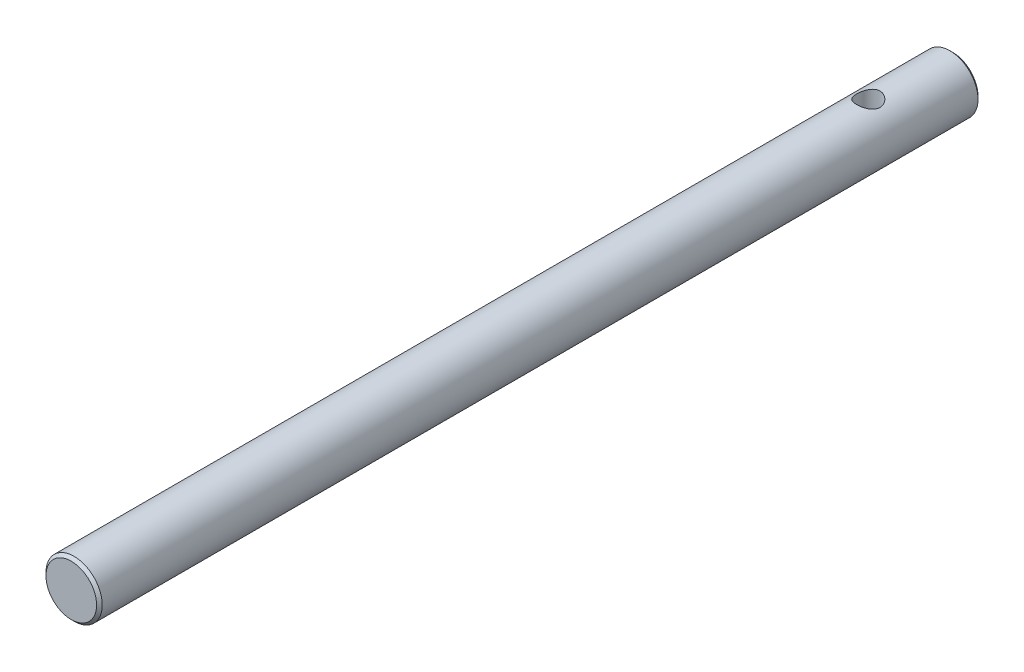
ISO-10303-21;
HEADER;
FILE_DESCRIPTION(('STEP AP214'),'2;1');
FILE_NAME('part.step','',(''),(''),'','','');
FILE_SCHEMA(('AUTOMOTIVE_DESIGN { 1 0 10303 214 1 1 1 1 }'));
ENDSEC;
DATA;
#1=APPLICATION_CONTEXT('core data for automotive mechanical design processes');
#2=APPLICATION_PROTOCOL_DEFINITION('international standard','automotive_design',2000,#1);
#3=PRODUCT_CONTEXT('',#1,'mechanical');
#4=PRODUCT('Part','Part','',(#3));
#5=PRODUCT_RELATED_PRODUCT_CATEGORY('part','',(#4));
#6=PRODUCT_DEFINITION_FORMATION('','',#4);
#7=PRODUCT_DEFINITION_CONTEXT('part definition',#1,'design');
#8=PRODUCT_DEFINITION('design','',#6,#7);
#9=PRODUCT_DEFINITION_SHAPE('','',#8);
#10=(LENGTH_UNIT() NAMED_UNIT(*) SI_UNIT(.MILLI.,.METRE.));
#11=(NAMED_UNIT(*) PLANE_ANGLE_UNIT() SI_UNIT($,.RADIAN.));
#12=(NAMED_UNIT(*) SI_UNIT($,.STERADIAN.) SOLID_ANGLE_UNIT());
#13=UNCERTAINTY_MEASURE_WITH_UNIT(LENGTH_MEASURE(1.E-05),#10,'distance_accuracy_value','');
#14=(GEOMETRIC_REPRESENTATION_CONTEXT(3) GLOBAL_UNCERTAINTY_ASSIGNED_CONTEXT((#13)) GLOBAL_UNIT_ASSIGNED_CONTEXT((#10,
#11,#12)) REPRESENTATION_CONTEXT('',''));
#15=CARTESIAN_POINT('',(0.,0.,0.));
#16=DIRECTION('',(0.,0.,1.));
#17=DIRECTION('',(1.,0.,0.));
#18=AXIS2_PLACEMENT_3D('',#15,#16,#17);
#19=CARTESIAN_POINT('',(0.,0.,94.));
#20=DIRECTION('',(0.,0.,-1.));
#21=DIRECTION('',(-1.,0.,0.));
#22=AXIS2_PLACEMENT_3D('',#19,#20,#21);
#23=CYLINDRICAL_SURFACE('',#22,3.);
#24=CARTESIAN_POINT('',(0.,0.,93.7));
#25=DIRECTION('',(0.,0.,1.));
#26=DIRECTION('',(1.,0.,0.));
#27=AXIS2_PLACEMENT_3D('',#24,#25,#26);
#28=CIRCLE('',#27,3.);
#29=CARTESIAN_POINT('',(3.,0.,93.7));
#30=VERTEX_POINT('',#29);
#31=EDGE_CURVE('E38',#30,#30,#28,.F.);
#32=ORIENTED_EDGE('',*,*,#31,.T.);
#33=EDGE_LOOP('',(#32));
#34=FACE_BOUND('',#33,.T.);
#35=CARTESIAN_POINT('',(0.,0.,0.300000000000036));
#36=DIRECTION('',(0.,0.,1.));
#37=DIRECTION('',(1.,0.,0.));
#38=AXIS2_PLACEMENT_3D('',#35,#36,#37);
#39=CIRCLE('',#38,3.);
#40=CARTESIAN_POINT('',(3.,0.,0.300000000000036));
#41=VERTEX_POINT('',#40);
#42=EDGE_CURVE('E42',#41,#41,#39,.T.);
#43=ORIENTED_EDGE('',*,*,#42,.T.);
#44=EDGE_LOOP('',(#43));
#45=FACE_BOUND('',#44,.T.);
#46=CARTESIAN_POINT('',(0.,-3.,10.25));
#47=CARTESIAN_POINT('',(0.0669580526362668,-2.99999458367273,10.2499927949087));
#48=CARTESIAN_POINT('',(0.134021397063841,-2.9977323297471,10.2445880414719));
#49=CARTESIAN_POINT('',(0.266247371156347,-2.98890153579552,10.2231609350798));
#50=CARTESIAN_POINT('',(0.331404576423564,-2.98232175901028,10.2071108755357));
#51=CARTESIAN_POINT('',(0.457688733653088,-2.96556289038127,10.1650889082194));
#52=CARTESIAN_POINT('',(0.518828524426269,-2.95539599975004,10.1391506105318));
#53=CARTESIAN_POINT('',(0.635829756679803,-2.93245286470664,10.0782271767674));
#54=CARTESIAN_POINT('',(0.69169279001594,-2.91967741092849,10.0432447810291));
#55=CARTESIAN_POINT('',(0.799448403559513,-2.89207828351869,9.96337101740911));
#56=CARTESIAN_POINT('',(0.85104126751777,-2.87718753326093,9.91809869121024));
#57=CARTESIAN_POINT('',(0.946159821091264,-2.84732714068513,9.81973566521743));
#58=CARTESIAN_POINT('',(0.989681263153087,-2.83235746106809,9.76664087510549));
#59=CARTESIAN_POINT('',(1.06953737697066,-2.80321021812995,9.6509732224351));
#60=CARTESIAN_POINT('',(1.10541308153925,-2.78910786873385,9.58806255157345));
#61=CARTESIAN_POINT('',(1.16593940588866,-2.76435572357005,9.45642674207907));
#62=CARTESIAN_POINT('',(1.19059580836291,-2.75370415000823,9.38770462051554));
#63=CARTESIAN_POINT('',(1.22674598312159,-2.73778555387705,9.24984630823207));
#64=CARTESIAN_POINT('',(1.23881657877606,-2.73228387651787,9.18088951660784));
#65=CARTESIAN_POINT('',(1.25125209967797,-2.72661326219504,9.04172670731342));
#66=CARTESIAN_POINT('',(1.25162348054397,-2.7264413842526,8.97152139997425));
#67=CARTESIAN_POINT('',(1.24108450363674,-2.73125119560852,8.83759993956506));
#68=CARTESIAN_POINT('',(1.23103681112301,-2.73583882723623,8.77379890343553));
#69=CARTESIAN_POINT('',(1.20139191015777,-2.74898482773796,8.6488879089996));
#70=CARTESIAN_POINT('',(1.18179287287177,-2.75754395703563,8.58777846850822));
#71=CARTESIAN_POINT('',(1.13321958727571,-2.77786184772756,8.46844229700855));
#72=CARTESIAN_POINT('',(1.10405471539236,-2.78968481949136,8.41030457908661));
#73=CARTESIAN_POINT('',(1.03731242580562,-2.81518331141086,8.29952226611985));
#74=CARTESIAN_POINT('',(0.999731690519546,-2.82885956129779,8.24687984938648));
#75=CARTESIAN_POINT('',(0.913495965543837,-2.85792976877979,8.14390004126716));
#76=CARTESIAN_POINT('',(0.864173483207529,-2.87337121404473,8.09413343261456));
#77=CARTESIAN_POINT('',(0.757729591051514,-2.90325673112529,8.00338649704081));
#78=CARTESIAN_POINT('',(0.700606359448459,-2.9177005687701,7.96240822830781));
#79=CARTESIAN_POINT('',(0.578447948693378,-2.94438283556473,7.88956417638373));
#80=CARTESIAN_POINT('',(0.513260582447682,-2.95656266543333,7.85793055484931));
#81=CARTESIAN_POINT('',(0.377852402526833,-2.97689481414803,7.80627886039673));
#82=CARTESIAN_POINT('',(0.307634394795036,-2.985049358458,7.78625436805618));
#83=CARTESIAN_POINT('',(0.16892811334623,-2.99599641186385,7.75958400787335));
#84=CARTESIAN_POINT('',(0.100611285278641,-2.99909541047125,7.75217214255624));
#85=CARTESIAN_POINT('',(-0.0363546554960879,-3.00056050368745,7.7486537763859));
#86=CARTESIAN_POINT('',(-0.105003667152635,-2.99892795711939,7.75254402974799));
#87=CARTESIAN_POINT('',(-0.237098242341435,-2.9913121765694,7.77097108480606));
#88=CARTESIAN_POINT('',(-0.300632966639386,-2.98554887283989,7.78496995409719));
#89=CARTESIAN_POINT('',(-0.424382748971091,-2.97048606772414,7.82246819454078));
#90=CARTESIAN_POINT('',(-0.484597386518361,-2.96118611959704,7.84596876595029));
#91=CARTESIAN_POINT('',(-0.602108999869137,-2.93958270645166,7.90257097571211));
#92=CARTESIAN_POINT('',(-0.659257236855325,-2.92719491469281,7.93594818314603));
#93=CARTESIAN_POINT('',(-0.76734621623143,-2.9007380457909,8.01105337779169));
#94=CARTESIAN_POINT('',(-0.818284352601942,-2.88666826768733,8.05278485152927));
#95=CARTESIAN_POINT('',(-0.916333430274264,-2.85712087895437,8.1469032332724));
#96=CARTESIAN_POINT('',(-0.962910697979836,-2.84161451591029,8.19983850298625));
#97=CARTESIAN_POINT('',(-1.04666984610551,-2.81184336768005,8.31302127593538));
#98=CARTESIAN_POINT('',(-1.08384959285618,-2.79757886493438,8.37327043517173));
#99=CARTESIAN_POINT('',(-1.14815960208699,-2.77181386243988,8.50061417530257));
#100=CARTESIAN_POINT('',(-1.17513918237329,-2.76035562555111,8.56779403551482));
#101=CARTESIAN_POINT('',(-1.21717413951573,-2.74208355658957,8.7063705938101));
#102=CARTESIAN_POINT('',(-1.23223934863688,-2.73526589555752,8.77776376248334));
#103=CARTESIAN_POINT('',(-1.24904080348901,-2.72763164537264,8.9168186991992));
#104=CARTESIAN_POINT('',(-1.25171380413129,-2.72639350967162,8.98434466229261));
#105=CARTESIAN_POINT('',(-1.24615575523912,-2.72893853011024,9.1188428611411));
#106=CARTESIAN_POINT('',(-1.23792637964722,-2.73272091540306,9.18581518031369));
#107=CARTESIAN_POINT('',(-1.21158404780491,-2.74449551302268,9.31409274746888));
#108=CARTESIAN_POINT('',(-1.19394903571466,-2.7522835484648,9.37551667346338));
#109=CARTESIAN_POINT('',(-1.14976328202135,-2.77103181199189,9.49454802135722));
#110=CARTESIAN_POINT('',(-1.12321003517252,-2.78199293131693,9.55215436539878));
#111=CARTESIAN_POINT('',(-1.0601028593549,-2.80666954560013,9.66569589594912));
#112=CARTESIAN_POINT('',(-1.02304360910483,-2.82051102713679,9.72132233016828));
#113=CARTESIAN_POINT('',(-0.940684072630393,-2.84903689053839,9.82586013936068));
#114=CARTESIAN_POINT('',(-0.89538092890562,-2.86372156345875,9.87476917560057));
#115=CARTESIAN_POINT('',(-0.793902045778821,-2.89356392850106,9.96814868168474));
#116=CARTESIAN_POINT('',(-0.737174739949028,-2.90867817511791,10.0120364328406));
#117=CARTESIAN_POINT('',(-0.6166000792532,-2.9366014362202,10.0896994535436));
#118=CARTESIAN_POINT('',(-0.552749497945747,-2.9494093991674,10.1234701148895));
#119=CARTESIAN_POINT('',(-0.420732056717951,-2.97109183362461,10.1792098454399));
#120=CARTESIAN_POINT('',(-0.352653990980636,-2.98002782581964,10.2013647666173));
#121=CARTESIAN_POINT('',(-0.213410421846559,-2.99321009768625,10.2337063290778));
#122=CARTESIAN_POINT('',(-0.142255316980959,-2.99747105811967,10.2439304425299));
#123=CARTESIAN_POINT('',(-0.0472360819191842,-2.99972287568934,10.2493331610864));
#124=CARTESIAN_POINT('',(-0.0236245946756576,-3.00000191102536,10.2500025421492));
#125=CARTESIAN_POINT('',(0.,-3.,10.25));
#126=B_SPLINE_CURVE_WITH_KNOTS('',3,(#46,#47,#48,#49,#50,#51,#52,#53,#54,#55,#56,#57,#58,#59,
#60,#61,#62,#63,#64,#65,#66,#67,#68,#69,#70,#71,#72,#73,#74,#75,#76,#77,#78,#79,#80,#81,#82,#83,
#84,#85,#86,#87,#88,#89,#90,#91,#92,#93,#94,#95,#96,#97,#98,#99,#100,#101,#102,#103,#104,#105,
#106,#107,#108,#109,#110,#111,#112,#113,#114,#115,#116,#117,#118,#119,#120,#121,#122,#123,#124,
#125),.UNSPECIFIED.,.T.,.F.,(4,2,2,2,2,2,2,2,2,2,2,2,2,2,2,2,2,2,2,2,2,2,2,2,2,2,2,2,2,2,2,2,2,
2,2,2,2,2,2,4),(0.,0.200806918883939,0.402138540628697,0.602791851906302,0.803384436852975,
1.01317936288807,1.22308438131466,1.44331724539125,1.66343646730588,1.87295273137558,
2.08235338249046,2.27570157202557,2.46908679727213,2.66658713058715,2.86416545717207,
3.07844141127897,3.29276749314588,3.51204055060814,3.73119224218297,3.93648443393251,
4.14171767493172,4.33676589735722,4.53183876601786,4.73297135272162,4.93418805469496,
5.14978488029295,5.36543061240342,5.58414788359524,5.80268447074581,6.00439877559645,
6.20608211297537,6.39837649964763,6.59072494950613,6.79463893397442,6.99862373425945,
7.2174653500489,7.43640649428584,7.65172855819386,7.86637250469322,7.93722256499099),.UNSPECIFIED.);
#127=CARTESIAN_POINT('',(0.,-3.,10.25));
#128=VERTEX_POINT('',#127);
#129=EDGE_CURVE('E51',#128,#128,#126,.T.);
#130=ORIENTED_EDGE('',*,*,#129,.T.);
#131=EDGE_LOOP('',(#130));
#132=FACE_BOUND('',#131,.T.);
#133=CARTESIAN_POINT('',(0.,3.,10.25));
#134=CARTESIAN_POINT('',(-0.0669580526362668,2.99999458367273,10.2499927949087));
#135=CARTESIAN_POINT('',(-0.134021397063841,2.9977323297471,10.2445880414719));
#136=CARTESIAN_POINT('',(-0.266247371156347,2.98890153579552,10.2231609350798));
#137=CARTESIAN_POINT('',(-0.331404576423564,2.98232175901028,10.2071108755357));
#138=CARTESIAN_POINT('',(-0.457688733653088,2.96556289038127,10.1650889082194));
#139=CARTESIAN_POINT('',(-0.518828524426269,2.95539599975004,10.1391506105318));
#140=CARTESIAN_POINT('',(-0.635829756679803,2.93245286470664,10.0782271767674));
#141=CARTESIAN_POINT('',(-0.69169279001594,2.91967741092849,10.0432447810291));
#142=CARTESIAN_POINT('',(-0.799448403559513,2.89207828351869,9.96337101740911));
#143=CARTESIAN_POINT('',(-0.85104126751777,2.87718753326093,9.91809869121024));
#144=CARTESIAN_POINT('',(-0.946159821091264,2.84732714068513,9.81973566521743));
#145=CARTESIAN_POINT('',(-0.989681263153087,2.83235746106809,9.76664087510549));
#146=CARTESIAN_POINT('',(-1.06953737697066,2.80321021812995,9.6509732224351));
#147=CARTESIAN_POINT('',(-1.10541308153925,2.78910786873385,9.58806255157345));
#148=CARTESIAN_POINT('',(-1.16593940588866,2.76435572357005,9.45642674207907));
#149=CARTESIAN_POINT('',(-1.19059580836291,2.75370415000823,9.38770462051554));
#150=CARTESIAN_POINT('',(-1.22674598312159,2.73778555387705,9.24984630823207));
#151=CARTESIAN_POINT('',(-1.23881657877606,2.73228387651787,9.18088951660784));
#152=CARTESIAN_POINT('',(-1.25125209967797,2.72661326219504,9.04172670731342));
#153=CARTESIAN_POINT('',(-1.25162348054397,2.7264413842526,8.97152139997425));
#154=CARTESIAN_POINT('',(-1.24108450363674,2.73125119560852,8.83759993956506));
#155=CARTESIAN_POINT('',(-1.23103681112301,2.73583882723623,8.77379890343553));
#156=CARTESIAN_POINT('',(-1.20139191015777,2.74898482773796,8.6488879089996));
#157=CARTESIAN_POINT('',(-1.18179287287177,2.75754395703563,8.58777846850822));
#158=CARTESIAN_POINT('',(-1.13321958727571,2.77786184772756,8.46844229700855));
#159=CARTESIAN_POINT('',(-1.10405471539236,2.78968481949136,8.41030457908661));
#160=CARTESIAN_POINT('',(-1.03731242580562,2.81518331141086,8.29952226611985));
#161=CARTESIAN_POINT('',(-0.999731690519546,2.82885956129779,8.24687984938648));
#162=CARTESIAN_POINT('',(-0.913495965543837,2.85792976877979,8.14390004126716));
#163=CARTESIAN_POINT('',(-0.864173483207529,2.87337121404473,8.09413343261456));
#164=CARTESIAN_POINT('',(-0.757729591051514,2.90325673112529,8.00338649704081));
#165=CARTESIAN_POINT('',(-0.700606359448459,2.9177005687701,7.96240822830781));
#166=CARTESIAN_POINT('',(-0.578447948693378,2.94438283556473,7.88956417638373));
#167=CARTESIAN_POINT('',(-0.513260582447682,2.95656266543333,7.85793055484931));
#168=CARTESIAN_POINT('',(-0.377852402526833,2.97689481414803,7.80627886039673));
#169=CARTESIAN_POINT('',(-0.307634394795036,2.985049358458,7.78625436805618));
#170=CARTESIAN_POINT('',(-0.16892811334623,2.99599641186385,7.75958400787335));
#171=CARTESIAN_POINT('',(-0.100611285278641,2.99909541047125,7.75217214255624));
#172=CARTESIAN_POINT('',(0.0363546554960879,3.00056050368745,7.7486537763859));
#173=CARTESIAN_POINT('',(0.105003667152635,2.99892795711939,7.75254402974799));
#174=CARTESIAN_POINT('',(0.237098242341435,2.9913121765694,7.77097108480606));
#175=CARTESIAN_POINT('',(0.300632966639386,2.98554887283989,7.78496995409719));
#176=CARTESIAN_POINT('',(0.424382748971091,2.97048606772414,7.82246819454078));
#177=CARTESIAN_POINT('',(0.484597386518361,2.96118611959704,7.84596876595029));
#178=CARTESIAN_POINT('',(0.602108999869137,2.93958270645166,7.90257097571211));
#179=CARTESIAN_POINT('',(0.659257236855325,2.92719491469281,7.93594818314603));
#180=CARTESIAN_POINT('',(0.76734621623143,2.9007380457909,8.01105337779169));
#181=CARTESIAN_POINT('',(0.818284352601942,2.88666826768733,8.05278485152927));
#182=CARTESIAN_POINT('',(0.916333430274264,2.85712087895437,8.1469032332724));
#183=CARTESIAN_POINT('',(0.962910697979836,2.84161451591029,8.19983850298625));
#184=CARTESIAN_POINT('',(1.04666984610551,2.81184336768005,8.31302127593538));
#185=CARTESIAN_POINT('',(1.08384959285618,2.79757886493438,8.37327043517173));
#186=CARTESIAN_POINT('',(1.14815960208699,2.77181386243988,8.50061417530257));
#187=CARTESIAN_POINT('',(1.17513918237329,2.76035562555111,8.56779403551482));
#188=CARTESIAN_POINT('',(1.21717413951573,2.74208355658957,8.7063705938101));
#189=CARTESIAN_POINT('',(1.23223934863688,2.73526589555752,8.77776376248334));
#190=CARTESIAN_POINT('',(1.24904080348901,2.72763164537264,8.9168186991992));
#191=CARTESIAN_POINT('',(1.25171380413129,2.72639350967162,8.98434466229261));
#192=CARTESIAN_POINT('',(1.24615575523912,2.72893853011024,9.1188428611411));
#193=CARTESIAN_POINT('',(1.23792637964722,2.73272091540306,9.18581518031369));
#194=CARTESIAN_POINT('',(1.21158404780491,2.74449551302268,9.31409274746888));
#195=CARTESIAN_POINT('',(1.19394903571466,2.7522835484648,9.37551667346338));
#196=CARTESIAN_POINT('',(1.14976328202135,2.77103181199189,9.49454802135722));
#197=CARTESIAN_POINT('',(1.12321003517252,2.78199293131693,9.55215436539878));
#198=CARTESIAN_POINT('',(1.0601028593549,2.80666954560013,9.66569589594912));
#199=CARTESIAN_POINT('',(1.02304360910483,2.82051102713679,9.72132233016828));
#200=CARTESIAN_POINT('',(0.940684072630393,2.84903689053839,9.82586013936068));
#201=CARTESIAN_POINT('',(0.89538092890562,2.86372156345875,9.87476917560057));
#202=CARTESIAN_POINT('',(0.793902045778821,2.89356392850106,9.96814868168474));
#203=CARTESIAN_POINT('',(0.737174739949028,2.90867817511791,10.0120364328406));
#204=CARTESIAN_POINT('',(0.6166000792532,2.9366014362202,10.0896994535436));
#205=CARTESIAN_POINT('',(0.552749497945747,2.9494093991674,10.1234701148895));
#206=CARTESIAN_POINT('',(0.420732056717951,2.97109183362461,10.1792098454399));
#207=CARTESIAN_POINT('',(0.352653990980636,2.98002782581964,10.2013647666173));
#208=CARTESIAN_POINT('',(0.213410421846559,2.99321009768625,10.2337063290778));
#209=CARTESIAN_POINT('',(0.142255316980959,2.99747105811967,10.2439304425299));
#210=CARTESIAN_POINT('',(0.0472360819191842,2.99972287568934,10.2493331610864));
#211=CARTESIAN_POINT('',(0.0236245946756576,3.00000191102536,10.2500025421492));
#212=CARTESIAN_POINT('',(0.,3.,10.25));
#213=B_SPLINE_CURVE_WITH_KNOTS('',3,(#133,#134,#135,#136,#137,#138,#139,#140,#141,#142,#143,
#144,#145,#146,#147,#148,#149,#150,#151,#152,#153,#154,#155,#156,#157,#158,#159,#160,#161,#162,
#163,#164,#165,#166,#167,#168,#169,#170,#171,#172,#173,#174,#175,#176,#177,#178,#179,#180,#181,
#182,#183,#184,#185,#186,#187,#188,#189,#190,#191,#192,#193,#194,#195,#196,#197,#198,#199,#200,
#201,#202,#203,#204,#205,#206,#207,#208,#209,#210,#211,#212),.UNSPECIFIED.,.T.,.F.,(4,2,2,2,2,2,
2,2,2,2,2,2,2,2,2,2,2,2,2,2,2,2,2,2,2,2,2,2,2,2,2,2,2,2,2,2,2,2,2,4),(0.,0.200806918883939,
0.402138540628697,0.602791851906302,0.803384436852975,1.01317936288807,1.22308438131466,
1.44331724539125,1.66343646730588,1.87295273137558,2.08235338249046,2.27570157202557,
2.46908679727213,2.66658713058715,2.86416545717207,3.07844141127897,3.29276749314588,
3.51204055060814,3.73119224218297,3.93648443393251,4.14171767493172,4.33676589735722,
4.53183876601786,4.73297135272162,4.93418805469496,5.14978488029295,5.36543061240342,
5.58414788359524,5.80268447074581,6.00439877559645,6.20608211297537,6.39837649964763,
6.59072494950613,6.79463893397442,6.99862373425945,7.2174653500489,7.43640649428584,
7.65172855819386,7.86637250469322,7.93722256499099),.UNSPECIFIED.);
#214=CARTESIAN_POINT('',(0.,3.,10.25));
#215=VERTEX_POINT('',#214);
#216=EDGE_CURVE('E59',#215,#215,#213,.T.);
#217=ORIENTED_EDGE('',*,*,#216,.T.);
#218=EDGE_LOOP('',(#217));
#219=FACE_BOUND('',#218,.T.);
#220=ADVANCED_FACE('F31',(#34,#45,#132,#219),#23,.T.);
#221=CARTESIAN_POINT('',(0.,0.,94.));
#222=DIRECTION('',(0.,0.,1.));
#223=DIRECTION('',(1.,0.,0.));
#224=AXIS2_PLACEMENT_3D('',#221,#222,#223);
#225=PLANE('',#224);
#226=CARTESIAN_POINT('',(0.,0.,94.));
#227=DIRECTION('',(0.,0.,1.));
#228=DIRECTION('',(1.,0.,0.));
#229=AXIS2_PLACEMENT_3D('',#226,#227,#228);
#230=CIRCLE('',#229,2.70000000000001);
#231=CARTESIAN_POINT('',(2.70000000000001,0.,94.));
#232=VERTEX_POINT('',#231);
#233=EDGE_CURVE('E46',#232,#232,#230,.T.);
#234=ORIENTED_EDGE('',*,*,#233,.T.);
#235=EDGE_LOOP('',(#234));
#236=FACE_BOUND('',#235,.T.);
#237=ADVANCED_FACE('F72',(#236),#225,.T.);
#238=CARTESIAN_POINT('',(0.,0.,0.));
#239=DIRECTION('',(0.,0.,1.));
#240=DIRECTION('',(1.,0.,0.));
#241=AXIS2_PLACEMENT_3D('',#238,#239,#240);
#242=PLANE('',#241);
#243=CARTESIAN_POINT('',(0.,0.,0.));
#244=DIRECTION('',(0.,0.,1.));
#245=DIRECTION('',(1.,0.,0.));
#246=AXIS2_PLACEMENT_3D('',#243,#244,#245);
#247=CIRCLE('',#246,2.69999999999997);
#248=CARTESIAN_POINT('',(2.69999999999997,0.,0.));
#249=VERTEX_POINT('',#248);
#250=EDGE_CURVE('E10',#249,#249,#247,.F.);
#251=ORIENTED_EDGE('',*,*,#250,.T.);
#252=EDGE_LOOP('',(#251));
#253=FACE_BOUND('',#252,.T.);
#254=ADVANCED_FACE('F70',(#253),#242,.F.);
#255=CARTESIAN_POINT('',(0.,-3.,8.99999999999999));
#256=DIRECTION('',(0.,1.,0.));
#257=DIRECTION('',(0.,0.,1.));
#258=AXIS2_PLACEMENT_3D('',#255,#256,#257);
#259=CYLINDRICAL_SURFACE('',#258,1.25);
#260=ORIENTED_EDGE('',*,*,#216,.F.);
#261=EDGE_LOOP('',(#260));
#262=FACE_BOUND('',#261,.T.);
#263=ORIENTED_EDGE('',*,*,#129,.F.);
#264=EDGE_LOOP('',(#263));
#265=FACE_BOUND('',#264,.T.);
#266=ADVANCED_FACE('F65',(#262,#265),#259,.F.);
#267=CARTESIAN_POINT('',(0.,0.,94.));
#268=DIRECTION('',(0.,0.,-1.));
#269=DIRECTION('',(-1.,0.,0.));
#270=AXIS2_PLACEMENT_3D('',#267,#268,#269);
#271=CONICAL_SURFACE('',#270,2.70000000000001,0.785398163397466);
#272=ORIENTED_EDGE('',*,*,#31,.F.);
#273=EDGE_LOOP('',(#272));
#274=FACE_BOUND('',#273,.T.);
#275=ORIENTED_EDGE('',*,*,#233,.F.);
#276=EDGE_LOOP('',(#275));
#277=FACE_BOUND('',#276,.T.);
#278=ADVANCED_FACE('F69',(#274,#277),#271,.T.);
#279=CARTESIAN_POINT('',(0.,0.,0.300000000000036));
#280=DIRECTION('',(0.,0.,1.));
#281=DIRECTION('',(1.,0.,0.));
#282=AXIS2_PLACEMENT_3D('',#279,#280,#281);
#283=CONICAL_SURFACE('',#282,3.,0.785398163397443);
#284=ORIENTED_EDGE('',*,*,#250,.F.);
#285=EDGE_LOOP('',(#284));
#286=FACE_BOUND('',#285,.T.);
#287=ORIENTED_EDGE('',*,*,#42,.F.);
#288=EDGE_LOOP('',(#287));
#289=FACE_BOUND('',#288,.T.);
#290=ADVANCED_FACE('F33',(#286,#289),#283,.T.);
#291=CLOSED_SHELL('',(#220,#237,#254,#266,#278,#290));
#292=MANIFOLD_SOLID_BREP('B2',#291);
#293=ADVANCED_BREP_SHAPE_REPRESENTATION('',(#18,#292),#14);
#294=SHAPE_DEFINITION_REPRESENTATION(#9,#293);
ENDSEC;
END-ISO-10303-21;
